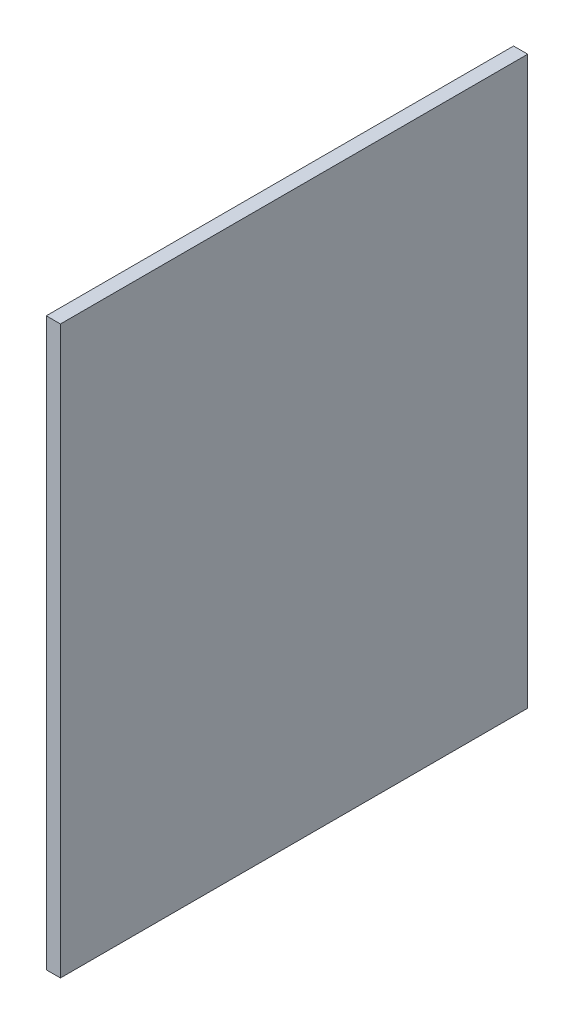
ISO-10303-21;
HEADER;
FILE_DESCRIPTION(('STEP AP214'),'2;1');
FILE_NAME('part.step','',(''),(''),'','','');
FILE_SCHEMA(('AUTOMOTIVE_DESIGN { 1 0 10303 214 1 1 1 1 }'));
ENDSEC;
DATA;
#1=APPLICATION_CONTEXT('core data for automotive mechanical design processes');
#2=APPLICATION_PROTOCOL_DEFINITION('international standard','automotive_design',2000,#1);
#3=PRODUCT_CONTEXT('',#1,'mechanical');
#4=PRODUCT('Part','Part','',(#3));
#5=PRODUCT_RELATED_PRODUCT_CATEGORY('part','',(#4));
#6=PRODUCT_DEFINITION_FORMATION('','',#4);
#7=PRODUCT_DEFINITION_CONTEXT('part definition',#1,'design');
#8=PRODUCT_DEFINITION('design','',#6,#7);
#9=PRODUCT_DEFINITION_SHAPE('','',#8);
#10=(LENGTH_UNIT() NAMED_UNIT(*) SI_UNIT(.MILLI.,.METRE.));
#11=(NAMED_UNIT(*) PLANE_ANGLE_UNIT() SI_UNIT($,.RADIAN.));
#12=(NAMED_UNIT(*) SI_UNIT($,.STERADIAN.) SOLID_ANGLE_UNIT());
#13=UNCERTAINTY_MEASURE_WITH_UNIT(LENGTH_MEASURE(1.E-05),#10,'distance_accuracy_value','');
#14=(GEOMETRIC_REPRESENTATION_CONTEXT(3) GLOBAL_UNCERTAINTY_ASSIGNED_CONTEXT((#13)) GLOBAL_UNIT_ASSIGNED_CONTEXT((#10,
#11,#12)) REPRESENTATION_CONTEXT('',''));
#15=CARTESIAN_POINT('',(0.,0.,0.));
#16=DIRECTION('',(0.,0.,1.));
#17=DIRECTION('',(1.,0.,0.));
#18=AXIS2_PLACEMENT_3D('',#15,#16,#17);
#19=CARTESIAN_POINT('',(5.,0.,0.));
#20=DIRECTION('',(0.,0.,-1.));
#21=DIRECTION('',(-1.,0.,0.));
#22=AXIS2_PLACEMENT_3D('',#19,#20,#21);
#23=PLANE('',#22);
#24=DIRECTION('',(0.,-1.,0.));
#25=VECTOR('',#24,1.);
#26=CARTESIAN_POINT('',(0.,0.,0.));
#27=LINE('',#26,#25);
#28=CARTESIAN_POINT('',(0.,200.,0.));
#29=VERTEX_POINT('',#28);
#30=CARTESIAN_POINT('',(0.,0.,0.));
#31=VERTEX_POINT('',#30);
#32=EDGE_CURVE('E95',#29,#31,#27,.T.);
#33=ORIENTED_EDGE('',*,*,#32,.T.);
#34=DIRECTION('',(-1.,0.,0.));
#35=VECTOR('',#34,1.);
#36=CARTESIAN_POINT('',(5.,0.,0.));
#37=LINE('',#36,#35);
#38=CARTESIAN_POINT('',(5.,0.,0.));
#39=VERTEX_POINT('',#38);
#40=EDGE_CURVE('E11',#39,#31,#37,.T.);
#41=ORIENTED_EDGE('',*,*,#40,.F.);
#42=DIRECTION('',(0.,-1.,0.));
#43=VECTOR('',#42,1.);
#44=CARTESIAN_POINT('',(5.,0.,0.));
#45=LINE('',#44,#43);
#46=CARTESIAN_POINT('',(5.,200.,0.));
#47=VERTEX_POINT('',#46);
#48=EDGE_CURVE('E83',#47,#39,#45,.T.);
#49=ORIENTED_EDGE('',*,*,#48,.F.);
#50=DIRECTION('',(-1.,0.,0.));
#51=VECTOR('',#50,1.);
#52=CARTESIAN_POINT('',(5.,200.,0.));
#53=LINE('',#52,#51);
#54=EDGE_CURVE('E91',#47,#29,#53,.T.);
#55=ORIENTED_EDGE('',*,*,#54,.T.);
#56=EDGE_LOOP('',(#33,#41,#49,#55));
#57=FACE_BOUND('',#56,.T.);
#58=ADVANCED_FACE('F32',(#57),#23,.F.);
#59=CARTESIAN_POINT('',(5.,0.,0.));
#60=DIRECTION('',(0.,1.,0.));
#61=DIRECTION('',(0.,0.,1.));
#62=AXIS2_PLACEMENT_3D('',#59,#60,#61);
#63=PLANE('',#62);
#64=DIRECTION('',(0.,0.,-1.));
#65=VECTOR('',#64,1.);
#66=CARTESIAN_POINT('',(0.,0.,0.));
#67=LINE('',#66,#65);
#68=CARTESIAN_POINT('',(0.,0.,-165.));
#69=VERTEX_POINT('',#68);
#70=EDGE_CURVE('E87',#31,#69,#67,.T.);
#71=ORIENTED_EDGE('',*,*,#70,.T.);
#72=DIRECTION('',(-1.,0.,0.));
#73=VECTOR('',#72,1.);
#74=CARTESIAN_POINT('',(5.,0.,-165.));
#75=LINE('',#74,#73);
#76=CARTESIAN_POINT('',(5.,0.,-165.));
#77=VERTEX_POINT('',#76);
#78=EDGE_CURVE('E40',#77,#69,#75,.T.);
#79=ORIENTED_EDGE('',*,*,#78,.F.);
#80=DIRECTION('',(0.,0.,-1.));
#81=VECTOR('',#80,1.);
#82=CARTESIAN_POINT('',(5.,0.,0.));
#83=LINE('',#82,#81);
#84=EDGE_CURVE('E78',#39,#77,#83,.T.);
#85=ORIENTED_EDGE('',*,*,#84,.F.);
#86=ORIENTED_EDGE('',*,*,#40,.T.);
#87=EDGE_LOOP('',(#71,#79,#85,#86));
#88=FACE_BOUND('',#87,.T.);
#89=ADVANCED_FACE('F86',(#88),#63,.F.);
#90=CARTESIAN_POINT('',(5.,0.,-165.));
#91=DIRECTION('',(0.,0.,1.));
#92=DIRECTION('',(1.,0.,0.));
#93=AXIS2_PLACEMENT_3D('',#90,#91,#92);
#94=PLANE('',#93);
#95=DIRECTION('',(0.,1.,0.));
#96=VECTOR('',#95,1.);
#97=CARTESIAN_POINT('',(0.,0.,-165.));
#98=LINE('',#97,#96);
#99=CARTESIAN_POINT('',(0.,200.,-165.));
#100=VERTEX_POINT('',#99);
#101=EDGE_CURVE('E65',#69,#100,#98,.T.);
#102=ORIENTED_EDGE('',*,*,#101,.T.);
#103=DIRECTION('',(-1.,0.,0.));
#104=VECTOR('',#103,1.);
#105=CARTESIAN_POINT('',(5.,200.,-165.));
#106=LINE('',#105,#104);
#107=CARTESIAN_POINT('',(5.,200.,-165.));
#108=VERTEX_POINT('',#107);
#109=EDGE_CURVE('E88',#108,#100,#106,.T.);
#110=ORIENTED_EDGE('',*,*,#109,.F.);
#111=DIRECTION('',(0.,1.,0.));
#112=VECTOR('',#111,1.);
#113=CARTESIAN_POINT('',(5.,0.,-165.));
#114=LINE('',#113,#112);
#115=EDGE_CURVE('E81',#77,#108,#114,.T.);
#116=ORIENTED_EDGE('',*,*,#115,.F.);
#117=ORIENTED_EDGE('',*,*,#78,.T.);
#118=EDGE_LOOP('',(#102,#110,#116,#117));
#119=FACE_BOUND('',#118,.T.);
#120=ADVANCED_FACE('F89',(#119),#94,.F.);
#121=CARTESIAN_POINT('',(5.,200.,0.));
#122=DIRECTION('',(0.,-1.,0.));
#123=DIRECTION('',(0.,0.,-1.));
#124=AXIS2_PLACEMENT_3D('',#121,#122,#123);
#125=PLANE('',#124);
#126=DIRECTION('',(0.,0.,1.));
#127=VECTOR('',#126,1.);
#128=CARTESIAN_POINT('',(0.,200.,0.));
#129=LINE('',#128,#127);
#130=EDGE_CURVE('E71',#100,#29,#129,.T.);
#131=ORIENTED_EDGE('',*,*,#130,.T.);
#132=ORIENTED_EDGE('',*,*,#54,.F.);
#133=DIRECTION('',(0.,0.,1.));
#134=VECTOR('',#133,1.);
#135=CARTESIAN_POINT('',(5.,200.,0.));
#136=LINE('',#135,#134);
#137=EDGE_CURVE('E48',#108,#47,#136,.T.);
#138=ORIENTED_EDGE('',*,*,#137,.F.);
#139=ORIENTED_EDGE('',*,*,#109,.T.);
#140=EDGE_LOOP('',(#131,#132,#138,#139));
#141=FACE_BOUND('',#140,.T.);
#142=ADVANCED_FACE('F102',(#141),#125,.F.);
#143=CARTESIAN_POINT('',(5.,0.,0.));
#144=DIRECTION('',(-1.,0.,0.));
#145=DIRECTION('',(0.,0.,1.));
#146=AXIS2_PLACEMENT_3D('',#143,#144,#145);
#147=PLANE('',#146);
#148=ORIENTED_EDGE('',*,*,#48,.T.);
#149=ORIENTED_EDGE('',*,*,#84,.T.);
#150=ORIENTED_EDGE('',*,*,#115,.T.);
#151=ORIENTED_EDGE('',*,*,#137,.T.);
#152=EDGE_LOOP('',(#148,#149,#150,#151));
#153=FACE_BOUND('',#152,.T.);
#154=ADVANCED_FACE('F79',(#153),#147,.F.);
#155=CARTESIAN_POINT('',(0.,0.,0.));
#156=DIRECTION('',(-1.,0.,0.));
#157=DIRECTION('',(0.,0.,1.));
#158=AXIS2_PLACEMENT_3D('',#155,#156,#157);
#159=PLANE('',#158);
#160=ORIENTED_EDGE('',*,*,#32,.F.);
#161=ORIENTED_EDGE('',*,*,#130,.F.);
#162=ORIENTED_EDGE('',*,*,#101,.F.);
#163=ORIENTED_EDGE('',*,*,#70,.F.);
#164=EDGE_LOOP('',(#160,#161,#162,#163));
#165=FACE_BOUND('',#164,.T.);
#166=ADVANCED_FACE('F105',(#165),#159,.T.);
#167=CLOSED_SHELL('',(#58,#89,#120,#142,#154,#166));
#168=MANIFOLD_SOLID_BREP('B2',#167);
#169=ADVANCED_BREP_SHAPE_REPRESENTATION('',(#18,#168),#14);
#170=SHAPE_DEFINITION_REPRESENTATION(#9,#169);
ENDSEC;
END-ISO-10303-21;
